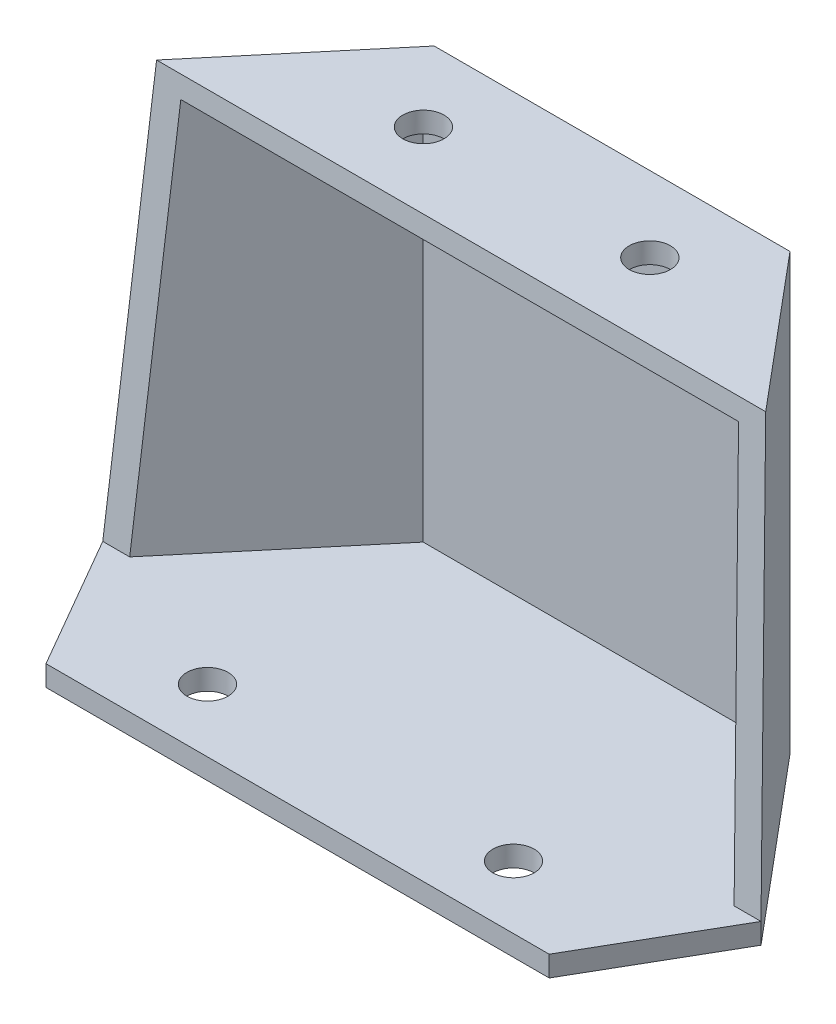
ISO-10303-21;
HEADER;
FILE_DESCRIPTION(('STEP AP214'),'2;1');
FILE_NAME('part.step','',(''),(''),'','','');
FILE_SCHEMA(('AUTOMOTIVE_DESIGN { 1 0 10303 214 1 1 1 1 }'));
ENDSEC;
DATA;
#1=APPLICATION_CONTEXT('core data for automotive mechanical design processes');
#2=APPLICATION_PROTOCOL_DEFINITION('international standard','automotive_design',2000,#1);
#3=PRODUCT_CONTEXT('',#1,'mechanical');
#4=PRODUCT('Part','Part','',(#3));
#5=PRODUCT_RELATED_PRODUCT_CATEGORY('part','',(#4));
#6=PRODUCT_DEFINITION_FORMATION('','',#4);
#7=PRODUCT_DEFINITION_CONTEXT('part definition',#1,'design');
#8=PRODUCT_DEFINITION('design','',#6,#7);
#9=PRODUCT_DEFINITION_SHAPE('','',#8);
#10=(LENGTH_UNIT() NAMED_UNIT(*) SI_UNIT(.MILLI.,.METRE.));
#11=(NAMED_UNIT(*) PLANE_ANGLE_UNIT() SI_UNIT($,.RADIAN.));
#12=(NAMED_UNIT(*) SI_UNIT($,.STERADIAN.) SOLID_ANGLE_UNIT());
#13=UNCERTAINTY_MEASURE_WITH_UNIT(LENGTH_MEASURE(1.E-05),#10,'distance_accuracy_value','');
#14=(GEOMETRIC_REPRESENTATION_CONTEXT(3) GLOBAL_UNCERTAINTY_ASSIGNED_CONTEXT((#13)) GLOBAL_UNIT_ASSIGNED_CONTEXT((#10,
#11,#12)) REPRESENTATION_CONTEXT('',''));
#15=CARTESIAN_POINT('',(0.,0.,0.));
#16=DIRECTION('',(0.,0.,1.));
#17=DIRECTION('',(1.,0.,0.));
#18=AXIS2_PLACEMENT_3D('',#15,#16,#17);
#19=CARTESIAN_POINT('',(159.592352403094,211.,-65.1118643381918));
#20=DIRECTION('',(-0.766044443118977,0.,0.642787609686541));
#21=DIRECTION('',(0.642787609686541,0.,0.766044443118977));
#22=AXIS2_PLACEMENT_3D('',#19,#20,#21);
#23=PLANE('',#22);
#24=DIRECTION('',(-0.64278760968654,0.,-0.766044443118977));
#25=VECTOR('',#24,1.);
#26=CARTESIAN_POINT('',(159.592352403094,211.,-65.1118643381918));
#27=LINE('',#26,#25);
#28=CARTESIAN_POINT('',(147.687093002177,211.,-79.3));
#29=VERTEX_POINT('',#28);
#30=CARTESIAN_POINT('',(86.265,211.,-152.5));
#31=VERTEX_POINT('',#30);
#32=EDGE_CURVE('E145',#29,#31,#27,.T.);
#33=ORIENTED_EDGE('',*,*,#32,.F.);
#34=DIRECTION('',(0.058980279511746,-0.995781425892182,0.0702899600003337));
#35=VECTOR('',#34,1.);
#36=CARTESIAN_POINT('',(147.787327569917,209.307710278525,-79.1805450937942));
#37=LINE('',#36,#35);
#38=CARTESIAN_POINT('',(159.592352403094,10.,-65.1118643381918));
#39=VERTEX_POINT('',#38);
#40=EDGE_CURVE('E56',#29,#39,#37,.T.);
#41=ORIENTED_EDGE('',*,*,#40,.T.);
#42=DIRECTION('',(0.,-1.,0.));
#43=VECTOR('',#42,1.);
#44=CARTESIAN_POINT('',(159.592352403094,211.,-65.1118643381918));
#45=LINE('',#44,#43);
#46=CARTESIAN_POINT('',(159.592352403094,0.,-65.1118643381918));
#47=VERTEX_POINT('',#46);
#48=EDGE_CURVE('E142',#39,#47,#45,.T.);
#49=ORIENTED_EDGE('',*,*,#48,.T.);
#50=DIRECTION('',(-0.64278760968654,0.,-0.766044443118977));
#51=VECTOR('',#50,1.);
#52=CARTESIAN_POINT('',(159.592352403094,0.,-65.1118643381918));
#53=LINE('',#52,#51);
#54=CARTESIAN_POINT('',(86.265,0.,-152.5));
#55=VERTEX_POINT('',#54);
#56=EDGE_CURVE('E208',#47,#55,#53,.T.);
#57=ORIENTED_EDGE('',*,*,#56,.T.);
#58=DIRECTION('',(0.,-1.,0.));
#59=VECTOR('',#58,1.);
#60=CARTESIAN_POINT('',(86.265,211.,-152.5));
#61=LINE('',#60,#59);
#62=EDGE_CURVE('E169',#31,#55,#61,.T.);
#63=ORIENTED_EDGE('',*,*,#62,.F.);
#64=EDGE_LOOP('',(#33,#41,#49,#57,#63));
#65=FACE_BOUND('',#64,.T.);
#66=ADVANCED_FACE('F39',(#65),#23,.F.);
#67=CARTESIAN_POINT('',(-86.265,211.,-152.5));
#68=DIRECTION('',(0.,0.,1.));
#69=DIRECTION('',(1.,0.,0.));
#70=AXIS2_PLACEMENT_3D('',#67,#68,#69);
#71=PLANE('',#70);
#72=DIRECTION('',(-1.,0.,0.));
#73=VECTOR('',#72,1.);
#74=CARTESIAN_POINT('',(-86.265,0.,-152.5));
#75=LINE('',#74,#73);
#76=CARTESIAN_POINT('',(-86.265,0.,-152.5));
#77=VERTEX_POINT('',#76);
#78=EDGE_CURVE('E220',#55,#77,#75,.T.);
#79=ORIENTED_EDGE('',*,*,#78,.T.);
#80=DIRECTION('',(0.,-1.,0.));
#81=VECTOR('',#80,1.);
#82=CARTESIAN_POINT('',(-86.265,211.,-152.5));
#83=LINE('',#82,#81);
#84=CARTESIAN_POINT('',(-86.265,211.,-152.5));
#85=VERTEX_POINT('',#84);
#86=EDGE_CURVE('E166',#85,#77,#83,.T.);
#87=ORIENTED_EDGE('',*,*,#86,.F.);
#88=DIRECTION('',(-1.,0.,0.));
#89=VECTOR('',#88,1.);
#90=CARTESIAN_POINT('',(-86.265,211.,-152.5));
#91=LINE('',#90,#89);
#92=EDGE_CURVE('E158',#31,#85,#91,.T.);
#93=ORIENTED_EDGE('',*,*,#92,.F.);
#94=ORIENTED_EDGE('',*,*,#62,.T.);
#95=EDGE_LOOP('',(#79,#87,#93,#94));
#96=FACE_BOUND('',#95,.T.);
#97=ADVANCED_FACE('F286',(#96),#71,.F.);
#98=CARTESIAN_POINT('',(-159.592352403094,211.,-65.1118643381918));
#99=DIRECTION('',(0.766044443118977,0.,0.642787609686541));
#100=DIRECTION('',(0.642787609686541,0.,-0.766044443118977));
#101=AXIS2_PLACEMENT_3D('',#98,#99,#100);
#102=PLANE('',#101);
#103=DIRECTION('',(0.,-1.,0.));
#104=VECTOR('',#103,1.);
#105=CARTESIAN_POINT('',(-159.592352403094,211.,-65.1118643381918));
#106=LINE('',#105,#104);
#107=CARTESIAN_POINT('',(-159.592352403094,10.,-65.1118643381918));
#108=VERTEX_POINT('',#107);
#109=CARTESIAN_POINT('',(-159.592352403094,0.,-65.1118643381918));
#110=VERTEX_POINT('',#109);
#111=EDGE_CURVE('E164',#108,#110,#106,.T.);
#112=ORIENTED_EDGE('',*,*,#111,.F.);
#113=DIRECTION('',(0.058980279511746,0.995781425892182,-0.0702899600003337));
#114=VECTOR('',#113,1.);
#115=CARTESIAN_POINT('',(-147.787327569917,209.307710278525,-79.1805450937942));
#116=LINE('',#115,#114);
#117=CARTESIAN_POINT('',(-147.687093002177,211.,-79.3));
#118=VERTEX_POINT('',#117);
#119=EDGE_CURVE('E146',#108,#118,#116,.T.);
#120=ORIENTED_EDGE('',*,*,#119,.T.);
#121=DIRECTION('',(-0.64278760968654,0.,0.766044443118977));
#122=VECTOR('',#121,1.);
#123=CARTESIAN_POINT('',(-159.592352403094,211.,-65.1118643381918));
#124=LINE('',#123,#122);
#125=EDGE_CURVE('E153',#85,#118,#124,.T.);
#126=ORIENTED_EDGE('',*,*,#125,.F.);
#127=ORIENTED_EDGE('',*,*,#86,.T.);
#128=DIRECTION('',(-0.64278760968654,0.,0.766044443118977));
#129=VECTOR('',#128,1.);
#130=CARTESIAN_POINT('',(-159.592352403094,0.,-65.1118643381918));
#131=LINE('',#130,#129);
#132=EDGE_CURVE('E215',#77,#110,#131,.T.);
#133=ORIENTED_EDGE('',*,*,#132,.T.);
#134=EDGE_LOOP('',(#112,#120,#126,#127,#133));
#135=FACE_BOUND('',#134,.T.);
#136=ADVANCED_FACE('F212',(#135),#102,.F.);
#137=CARTESIAN_POINT('',(-122.,211.,0.));
#138=DIRECTION('',(0.866025403784438,0.,-0.500000000000001));
#139=DIRECTION('',(-0.500000000000001,0.,-0.866025403784438));
#140=AXIS2_PLACEMENT_3D('',#137,#138,#139);
#141=PLANE('',#140);
#142=DIRECTION('',(0.,-1.,0.));
#143=VECTOR('',#142,1.);
#144=CARTESIAN_POINT('',(-122.,211.,0.));
#145=LINE('',#144,#143);
#146=CARTESIAN_POINT('',(-122.,10.,0.));
#147=VERTEX_POINT('',#146);
#148=CARTESIAN_POINT('',(-122.,0.,0.));
#149=VERTEX_POINT('',#148);
#150=EDGE_CURVE('E155',#147,#149,#145,.T.);
#151=ORIENTED_EDGE('',*,*,#150,.F.);
#152=DIRECTION('',(-0.500000000000001,0.,-0.866025403784438));
#153=VECTOR('',#152,1.);
#154=CARTESIAN_POINT('',(-122.,10.,0.));
#155=LINE('',#154,#153);
#156=EDGE_CURVE('E132',#147,#108,#155,.T.);
#157=ORIENTED_EDGE('',*,*,#156,.T.);
#158=ORIENTED_EDGE('',*,*,#111,.T.);
#159=DIRECTION('',(0.500000000000001,0.,0.866025403784438));
#160=VECTOR('',#159,1.);
#161=CARTESIAN_POINT('',(-122.,0.,0.));
#162=LINE('',#161,#160);
#163=EDGE_CURVE('E219',#110,#149,#162,.T.);
#164=ORIENTED_EDGE('',*,*,#163,.T.);
#165=EDGE_LOOP('',(#151,#157,#158,#164));
#166=FACE_BOUND('',#165,.T.);
#167=ADVANCED_FACE('F205',(#166),#141,.F.);
#168=CARTESIAN_POINT('',(122.,211.,0.));
#169=DIRECTION('',(0.,0.,-1.));
#170=DIRECTION('',(-1.,0.,0.));
#171=AXIS2_PLACEMENT_3D('',#168,#169,#170);
#172=PLANE('',#171);
#173=DIRECTION('',(0.,-1.,0.));
#174=VECTOR('',#173,1.);
#175=CARTESIAN_POINT('',(122.,211.,0.));
#176=LINE('',#175,#174);
#177=CARTESIAN_POINT('',(122.,10.,0.));
#178=VERTEX_POINT('',#177);
#179=CARTESIAN_POINT('',(122.,0.,0.));
#180=VERTEX_POINT('',#179);
#181=EDGE_CURVE('E152',#178,#180,#176,.T.);
#182=ORIENTED_EDGE('',*,*,#181,.F.);
#183=DIRECTION('',(1.,0.,0.));
#184=VECTOR('',#183,1.);
#185=CARTESIAN_POINT('',(-159.592352403094,10.,0.));
#186=LINE('',#185,#184);
#187=EDGE_CURVE('E128',#147,#178,#186,.T.);
#188=ORIENTED_EDGE('',*,*,#187,.F.);
#189=ORIENTED_EDGE('',*,*,#150,.T.);
#190=DIRECTION('',(1.,0.,0.));
#191=VECTOR('',#190,1.);
#192=CARTESIAN_POINT('',(122.,0.,0.));
#193=LINE('',#192,#191);
#194=EDGE_CURVE('E225',#149,#180,#193,.T.);
#195=ORIENTED_EDGE('',*,*,#194,.T.);
#196=EDGE_LOOP('',(#182,#188,#189,#195));
#197=FACE_BOUND('',#196,.T.);
#198=ADVANCED_FACE('F326',(#197),#172,.F.);
#199=CARTESIAN_POINT('',(122.,211.,0.));
#200=DIRECTION('',(-0.866025403784438,0.,-0.500000000000001));
#201=DIRECTION('',(-0.500000000000001,0.,0.866025403784438));
#202=AXIS2_PLACEMENT_3D('',#199,#200,#201);
#203=PLANE('',#202);
#204=ORIENTED_EDGE('',*,*,#48,.F.);
#205=DIRECTION('',(-0.500000000000001,0.,0.866025403784438));
#206=VECTOR('',#205,1.);
#207=CARTESIAN_POINT('',(122.,10.,0.));
#208=LINE('',#207,#206);
#209=EDGE_CURVE('E124',#39,#178,#208,.T.);
#210=ORIENTED_EDGE('',*,*,#209,.T.);
#211=ORIENTED_EDGE('',*,*,#181,.T.);
#212=DIRECTION('',(0.500000000000001,0.,-0.866025403784438));
#213=VECTOR('',#212,1.);
#214=CARTESIAN_POINT('',(122.,0.,0.));
#215=LINE('',#214,#213);
#216=EDGE_CURVE('E150',#180,#47,#215,.T.);
#217=ORIENTED_EDGE('',*,*,#216,.T.);
#218=EDGE_LOOP('',(#204,#210,#211,#217));
#219=FACE_BOUND('',#218,.T.);
#220=ADVANCED_FACE('F148',(#219),#203,.F.);
#221=CARTESIAN_POINT('',(0.,211.,0.));
#222=DIRECTION('',(0.,-1.,0.));
#223=DIRECTION('',(0.,0.,-1.));
#224=AXIS2_PLACEMENT_3D('',#221,#222,#223);
#225=PLANE('',#224);
#226=CARTESIAN_POINT('',(-54.9,211.,-115.9));
#227=DIRECTION('',(0.,1.,0.));
#228=DIRECTION('',(0.,0.,1.));
#229=AXIS2_PLACEMENT_3D('',#226,#227,#228);
#230=CIRCLE('',#229,10.);
#231=CARTESIAN_POINT('',(-54.9,211.,-105.9));
#232=VERTEX_POINT('',#231);
#233=EDGE_CURVE('E237',#232,#232,#230,.T.);
#234=ORIENTED_EDGE('',*,*,#233,.F.);
#235=EDGE_LOOP('',(#234));
#236=FACE_BOUND('',#235,.T.);
#237=CARTESIAN_POINT('',(54.9,211.,-115.9));
#238=DIRECTION('',(0.,1.,0.));
#239=DIRECTION('',(0.,0.,1.));
#240=AXIS2_PLACEMENT_3D('',#237,#238,#239);
#241=CIRCLE('',#240,9.99999999999999);
#242=CARTESIAN_POINT('',(54.9,211.,-105.9));
#243=VERTEX_POINT('',#242);
#244=EDGE_CURVE('E240',#243,#243,#241,.T.);
#245=ORIENTED_EDGE('',*,*,#244,.F.);
#246=EDGE_LOOP('',(#245));
#247=FACE_BOUND('',#246,.T.);
#248=ORIENTED_EDGE('',*,*,#125,.T.);
#249=DIRECTION('',(1.,0.,0.));
#250=VECTOR('',#249,1.);
#251=CARTESIAN_POINT('',(-159.592352403094,211.,-79.3));
#252=LINE('',#251,#250);
#253=EDGE_CURVE('E201',#118,#29,#252,.T.);
#254=ORIENTED_EDGE('',*,*,#253,.T.);
#255=ORIENTED_EDGE('',*,*,#32,.T.);
#256=ORIENTED_EDGE('',*,*,#92,.T.);
#257=EDGE_LOOP('',(#248,#254,#255,#256));
#258=FACE_BOUND('',#257,.T.);
#259=ADVANCED_FACE('F315',(#236,#247,#258),#225,.F.);
#260=CARTESIAN_POINT('',(0.,0.,0.));
#261=DIRECTION('',(0.,-1.,0.));
#262=DIRECTION('',(0.,0.,-1.));
#263=AXIS2_PLACEMENT_3D('',#260,#261,#262);
#264=PLANE('',#263);
#265=CARTESIAN_POINT('',(-74.2,0.,-30.5));
#266=DIRECTION('',(0.,-1.,0.));
#267=DIRECTION('',(0.,0.,-1.));
#268=AXIS2_PLACEMENT_3D('',#265,#266,#267);
#269=CIRCLE('',#268,9.99999999999999);
#270=CARTESIAN_POINT('',(-74.2,0.,-40.5));
#271=VERTEX_POINT('',#270);
#272=EDGE_CURVE('E258',#271,#271,#269,.F.);
#273=ORIENTED_EDGE('',*,*,#272,.T.);
#274=EDGE_LOOP('',(#273));
#275=FACE_BOUND('',#274,.T.);
#276=CARTESIAN_POINT('',(74.2,0.,-30.5));
#277=DIRECTION('',(0.,-1.,0.));
#278=DIRECTION('',(0.,0.,-1.));
#279=AXIS2_PLACEMENT_3D('',#276,#277,#278);
#280=CIRCLE('',#279,10.);
#281=CARTESIAN_POINT('',(74.2,0.,-40.5));
#282=VERTEX_POINT('',#281);
#283=EDGE_CURVE('E252',#282,#282,#280,.F.);
#284=ORIENTED_EDGE('',*,*,#283,.T.);
#285=EDGE_LOOP('',(#284));
#286=FACE_BOUND('',#285,.T.);
#287=ORIENTED_EDGE('',*,*,#56,.F.);
#288=ORIENTED_EDGE('',*,*,#216,.F.);
#289=ORIENTED_EDGE('',*,*,#194,.F.);
#290=ORIENTED_EDGE('',*,*,#163,.F.);
#291=ORIENTED_EDGE('',*,*,#132,.F.);
#292=ORIENTED_EDGE('',*,*,#78,.F.);
#293=EDGE_LOOP('',(#287,#288,#289,#290,#291,#292));
#294=FACE_BOUND('',#293,.T.);
#295=ADVANCED_FACE('F223',(#275,#286,#294),#264,.T.);
#296=CARTESIAN_POINT('',(-159.592352403094,211.,-79.3));
#297=DIRECTION('',(0.,-0.0704125378053743,-0.997517956991154));
#298=DIRECTION('',(0.,0.997517956991155,-0.0704125378053743));
#299=AXIS2_PLACEMENT_3D('',#296,#297,#298);
#300=PLANE('',#299);
#301=ORIENTED_EDGE('',*,*,#253,.F.);
#302=ORIENTED_EDGE('',*,*,#119,.F.);
#303=DIRECTION('',(1.,0.,0.));
#304=VECTOR('',#303,1.);
#305=CARTESIAN_POINT('',(-159.592352403094,10.,-65.1118643381918));
#306=LINE('',#305,#304);
#307=CARTESIAN_POINT('',(-146.538279509771,10.,-65.1118643381918));
#308=VERTEX_POINT('',#307);
#309=EDGE_CURVE('E137',#108,#308,#306,.T.);
#310=ORIENTED_EDGE('',*,*,#309,.T.);
#311=DIRECTION('',(0.058980279511746,0.995781425892182,-0.0702899600003337));
#312=VECTOR('',#311,1.);
#313=CARTESIAN_POINT('',(-134.778665532355,208.541025429372,-79.1264265432985));
#314=LINE('',#313,#312);
#315=CARTESIAN_POINT('',(-135.225321571586,201.,-78.5941226038901));
#316=VERTEX_POINT('',#315);
#317=EDGE_CURVE('E63',#308,#316,#314,.T.);
#318=ORIENTED_EDGE('',*,*,#317,.T.);
#319=DIRECTION('',(1.,0.,0.));
#320=VECTOR('',#319,1.);
#321=CARTESIAN_POINT('',(0.,201.,-78.5941226038901));
#322=LINE('',#321,#320);
#323=CARTESIAN_POINT('',(135.225321571586,201.,-78.5941226038901));
#324=VERTEX_POINT('',#323);
#325=EDGE_CURVE('E235',#316,#324,#322,.T.);
#326=ORIENTED_EDGE('',*,*,#325,.T.);
#327=DIRECTION('',(0.058980279511746,-0.995781425892182,0.0702899600003337));
#328=VECTOR('',#327,1.);
#329=CARTESIAN_POINT('',(134.778665532355,208.541025429372,-79.1264265432985));
#330=LINE('',#329,#328);
#331=CARTESIAN_POINT('',(146.538279509771,10.,-65.1118643381918));
#332=VERTEX_POINT('',#331);
#333=EDGE_CURVE('E136',#324,#332,#330,.T.);
#334=ORIENTED_EDGE('',*,*,#333,.T.);
#335=EDGE_CURVE('E125',#332,#39,#306,.T.);
#336=ORIENTED_EDGE('',*,*,#335,.T.);
#337=ORIENTED_EDGE('',*,*,#40,.F.);
#338=EDGE_LOOP('',(#301,#302,#310,#318,#326,#334,#336,#337));
#339=FACE_BOUND('',#338,.T.);
#340=ADVANCED_FACE('F134',(#339),#300,.F.);
#341=CARTESIAN_POINT('',(151.931907971904,211.,-58.6839882413264));
#342=DIRECTION('',(-0.766044443118977,0.,0.642787609686541));
#343=DIRECTION('',(0.642787609686541,0.,0.766044443118977));
#344=AXIS2_PLACEMENT_3D('',#341,#342,#343);
#345=PLANE('',#344);
#346=ORIENTED_EDGE('',*,*,#333,.F.);
#347=DIRECTION('',(-0.642787609686541,0.,-0.766044443118977));
#348=VECTOR('',#347,1.);
#349=CARTESIAN_POINT('',(118.05352675921,201.,-99.0586707628305));
#350=LINE('',#349,#348);
#351=CARTESIAN_POINT('',(81.60192341845,201.,-142.5));
#352=VERTEX_POINT('',#351);
#353=EDGE_CURVE('E173',#324,#352,#350,.T.);
#354=ORIENTED_EDGE('',*,*,#353,.T.);
#355=DIRECTION('',(0.,-1.,0.));
#356=VECTOR('',#355,1.);
#357=CARTESIAN_POINT('',(81.60192341845,211.,-142.5));
#358=LINE('',#357,#356);
#359=CARTESIAN_POINT('',(81.60192341845,10.,-142.5));
#360=VERTEX_POINT('',#359);
#361=EDGE_CURVE('E181',#352,#360,#358,.T.);
#362=ORIENTED_EDGE('',*,*,#361,.T.);
#363=DIRECTION('',(-0.642787609686541,0.,-0.766044443118977));
#364=VECTOR('',#363,1.);
#365=CARTESIAN_POINT('',(118.05352675921,10.,-99.0586707628305));
#366=LINE('',#365,#364);
#367=EDGE_CURVE('E43',#332,#360,#366,.T.);
#368=ORIENTED_EDGE('',*,*,#367,.F.);
#369=EDGE_LOOP('',(#346,#354,#362,#368));
#370=FACE_BOUND('',#369,.T.);
#371=ADVANCED_FACE('F191',(#370),#345,.T.);
#372=CARTESIAN_POINT('',(-86.265,211.,-142.5));
#373=DIRECTION('',(0.,0.,1.));
#374=DIRECTION('',(1.,0.,0.));
#375=AXIS2_PLACEMENT_3D('',#372,#373,#374);
#376=PLANE('',#375);
#377=DIRECTION('',(-1.,0.,0.));
#378=VECTOR('',#377,1.);
#379=CARTESIAN_POINT('',(0.,10.,-142.5));
#380=LINE('',#379,#378);
#381=CARTESIAN_POINT('',(-81.60192341845,10.,-142.5));
#382=VERTEX_POINT('',#381);
#383=EDGE_CURVE('E183',#360,#382,#380,.T.);
#384=ORIENTED_EDGE('',*,*,#383,.F.);
#385=ORIENTED_EDGE('',*,*,#361,.F.);
#386=DIRECTION('',(-1.,0.,0.));
#387=VECTOR('',#386,1.);
#388=CARTESIAN_POINT('',(0.,201.,-142.5));
#389=LINE('',#388,#387);
#390=CARTESIAN_POINT('',(-81.60192341845,201.,-142.5));
#391=VERTEX_POINT('',#390);
#392=EDGE_CURVE('E48',#352,#391,#389,.T.);
#393=ORIENTED_EDGE('',*,*,#392,.T.);
#394=DIRECTION('',(0.,-1.,0.));
#395=VECTOR('',#394,1.);
#396=CARTESIAN_POINT('',(-81.60192341845,211.,-142.5));
#397=LINE('',#396,#395);
#398=EDGE_CURVE('E175',#391,#382,#397,.T.);
#399=ORIENTED_EDGE('',*,*,#398,.T.);
#400=EDGE_LOOP('',(#384,#385,#393,#399));
#401=FACE_BOUND('',#400,.T.);
#402=ADVANCED_FACE('F188',(#401),#376,.T.);
#403=CARTESIAN_POINT('',(-151.931907971904,211.,-58.6839882413264));
#404=DIRECTION('',(0.766044443118977,0.,0.642787609686541));
#405=DIRECTION('',(0.642787609686541,0.,-0.766044443118977));
#406=AXIS2_PLACEMENT_3D('',#403,#404,#405);
#407=PLANE('',#406);
#408=ORIENTED_EDGE('',*,*,#317,.F.);
#409=DIRECTION('',(-0.642787609686541,0.,0.766044443118977));
#410=VECTOR('',#409,1.);
#411=CARTESIAN_POINT('',(-118.05352675921,10.,-99.0586707628305));
#412=LINE('',#411,#410);
#413=EDGE_CURVE('E178',#382,#308,#412,.T.);
#414=ORIENTED_EDGE('',*,*,#413,.F.);
#415=ORIENTED_EDGE('',*,*,#398,.F.);
#416=DIRECTION('',(-0.642787609686541,0.,0.766044443118977));
#417=VECTOR('',#416,1.);
#418=CARTESIAN_POINT('',(-118.05352675921,201.,-99.0586707628305));
#419=LINE('',#418,#417);
#420=EDGE_CURVE('E11',#391,#316,#419,.T.);
#421=ORIENTED_EDGE('',*,*,#420,.T.);
#422=EDGE_LOOP('',(#408,#414,#415,#421));
#423=FACE_BOUND('',#422,.T.);
#424=ADVANCED_FACE('F198',(#423),#407,.T.);
#425=CARTESIAN_POINT('',(0.,201.,0.));
#426=DIRECTION('',(0.,-1.,0.));
#427=DIRECTION('',(0.,0.,-1.));
#428=AXIS2_PLACEMENT_3D('',#425,#426,#427);
#429=PLANE('',#428);
#430=CARTESIAN_POINT('',(-54.9,201.,-115.9));
#431=DIRECTION('',(0.,-1.,0.));
#432=DIRECTION('',(0.,0.,-1.));
#433=AXIS2_PLACEMENT_3D('',#430,#431,#432);
#434=CIRCLE('',#433,10.);
#435=CARTESIAN_POINT('',(-54.9,201.,-125.9));
#436=VERTEX_POINT('',#435);
#437=EDGE_CURVE('E243',#436,#436,#434,.F.);
#438=ORIENTED_EDGE('',*,*,#437,.T.);
#439=EDGE_LOOP('',(#438));
#440=FACE_BOUND('',#439,.T.);
#441=CARTESIAN_POINT('',(54.9,201.,-115.9));
#442=DIRECTION('',(0.,-1.,0.));
#443=DIRECTION('',(0.,0.,-1.));
#444=AXIS2_PLACEMENT_3D('',#441,#442,#443);
#445=CIRCLE('',#444,9.99999999999999);
#446=CARTESIAN_POINT('',(54.9,201.,-125.9));
#447=VERTEX_POINT('',#446);
#448=EDGE_CURVE('E244',#447,#447,#445,.F.);
#449=ORIENTED_EDGE('',*,*,#448,.T.);
#450=EDGE_LOOP('',(#449));
#451=FACE_BOUND('',#450,.T.);
#452=ORIENTED_EDGE('',*,*,#325,.F.);
#453=ORIENTED_EDGE('',*,*,#420,.F.);
#454=ORIENTED_EDGE('',*,*,#392,.F.);
#455=ORIENTED_EDGE('',*,*,#353,.F.);
#456=EDGE_LOOP('',(#452,#453,#454,#455));
#457=FACE_BOUND('',#456,.T.);
#458=ADVANCED_FACE('F196',(#440,#451,#457),#429,.T.);
#459=CARTESIAN_POINT('',(0.,10.,0.));
#460=DIRECTION('',(0.,-1.,0.));
#461=DIRECTION('',(0.,0.,-1.));
#462=AXIS2_PLACEMENT_3D('',#459,#460,#461);
#463=PLANE('',#462);
#464=CARTESIAN_POINT('',(-74.2,10.,-30.5));
#465=DIRECTION('',(0.,1.,0.));
#466=DIRECTION('',(0.,0.,1.));
#467=AXIS2_PLACEMENT_3D('',#464,#465,#466);
#468=CIRCLE('',#467,9.99999999999999);
#469=CARTESIAN_POINT('',(-74.2,10.,-20.5));
#470=VERTEX_POINT('',#469);
#471=EDGE_CURVE('E247',#470,#470,#468,.T.);
#472=ORIENTED_EDGE('',*,*,#471,.F.);
#473=EDGE_LOOP('',(#472));
#474=FACE_BOUND('',#473,.T.);
#475=CARTESIAN_POINT('',(74.2,10.,-30.5));
#476=DIRECTION('',(0.,1.,0.));
#477=DIRECTION('',(0.,0.,1.));
#478=AXIS2_PLACEMENT_3D('',#475,#476,#477);
#479=CIRCLE('',#478,10.);
#480=CARTESIAN_POINT('',(74.2,10.,-20.5));
#481=VERTEX_POINT('',#480);
#482=EDGE_CURVE('E255',#481,#481,#479,.T.);
#483=ORIENTED_EDGE('',*,*,#482,.F.);
#484=EDGE_LOOP('',(#483));
#485=FACE_BOUND('',#484,.T.);
#486=ORIENTED_EDGE('',*,*,#335,.F.);
#487=ORIENTED_EDGE('',*,*,#367,.T.);
#488=ORIENTED_EDGE('',*,*,#383,.T.);
#489=ORIENTED_EDGE('',*,*,#413,.T.);
#490=ORIENTED_EDGE('',*,*,#309,.F.);
#491=ORIENTED_EDGE('',*,*,#156,.F.);
#492=ORIENTED_EDGE('',*,*,#187,.T.);
#493=ORIENTED_EDGE('',*,*,#209,.F.);
#494=EDGE_LOOP('',(#486,#487,#488,#489,#490,#491,#492,#493));
#495=FACE_BOUND('',#494,.T.);
#496=ADVANCED_FACE('F41',(#474,#485,#495),#463,.F.);
#497=CARTESIAN_POINT('',(54.9,-0.001000000000001,-115.9));
#498=DIRECTION('',(0.,1.,0.));
#499=DIRECTION('',(0.,0.,1.));
#500=AXIS2_PLACEMENT_3D('',#497,#498,#499);
#501=CYLINDRICAL_SURFACE('',#500,9.99999999999999);
#502=ORIENTED_EDGE('',*,*,#448,.F.);
#503=EDGE_LOOP('',(#502));
#504=FACE_BOUND('',#503,.T.);
#505=ORIENTED_EDGE('',*,*,#244,.T.);
#506=EDGE_LOOP('',(#505));
#507=FACE_BOUND('',#506,.T.);
#508=ADVANCED_FACE('F268',(#504,#507),#501,.F.);
#509=CARTESIAN_POINT('',(-54.9,-0.001000000000001,-115.9));
#510=DIRECTION('',(0.,1.,0.));
#511=DIRECTION('',(0.,0.,1.));
#512=AXIS2_PLACEMENT_3D('',#509,#510,#511);
#513=CYLINDRICAL_SURFACE('',#512,10.);
#514=ORIENTED_EDGE('',*,*,#437,.F.);
#515=EDGE_LOOP('',(#514));
#516=FACE_BOUND('',#515,.T.);
#517=ORIENTED_EDGE('',*,*,#233,.T.);
#518=EDGE_LOOP('',(#517));
#519=FACE_BOUND('',#518,.T.);
#520=ADVANCED_FACE('F273',(#516,#519),#513,.F.);
#521=CARTESIAN_POINT('',(74.2,-0.000999999999999265,-30.5));
#522=DIRECTION('',(0.,1.,0.));
#523=DIRECTION('',(0.,0.,1.));
#524=AXIS2_PLACEMENT_3D('',#521,#522,#523);
#525=CYLINDRICAL_SURFACE('',#524,10.);
#526=ORIENTED_EDGE('',*,*,#283,.F.);
#527=EDGE_LOOP('',(#526));
#528=FACE_BOUND('',#527,.T.);
#529=ORIENTED_EDGE('',*,*,#482,.T.);
#530=EDGE_LOOP('',(#529));
#531=FACE_BOUND('',#530,.T.);
#532=ADVANCED_FACE('F271',(#528,#531),#525,.F.);
#533=CARTESIAN_POINT('',(-74.2,-0.000999999999999265,-30.5));
#534=DIRECTION('',(0.,1.,0.));
#535=DIRECTION('',(0.,0.,1.));
#536=AXIS2_PLACEMENT_3D('',#533,#534,#535);
#537=CYLINDRICAL_SURFACE('',#536,9.99999999999999);
#538=ORIENTED_EDGE('',*,*,#272,.F.);
#539=EDGE_LOOP('',(#538));
#540=FACE_BOUND('',#539,.T.);
#541=ORIENTED_EDGE('',*,*,#471,.T.);
#542=EDGE_LOOP('',(#541));
#543=FACE_BOUND('',#542,.T.);
#544=ADVANCED_FACE('F264',(#540,#543),#537,.F.);
#545=CLOSED_SHELL('',(#66,#97,#136,#167,#198,#220,#259,#295,#340,#371,#402,#424,#458,#496,#508,
#520,#532,#544));
#546=MANIFOLD_SOLID_BREP('B2',#545);
#547=ADVANCED_BREP_SHAPE_REPRESENTATION('',(#18,#546),#14);
#548=SHAPE_DEFINITION_REPRESENTATION(#9,#547);
ENDSEC;
END-ISO-10303-21;
